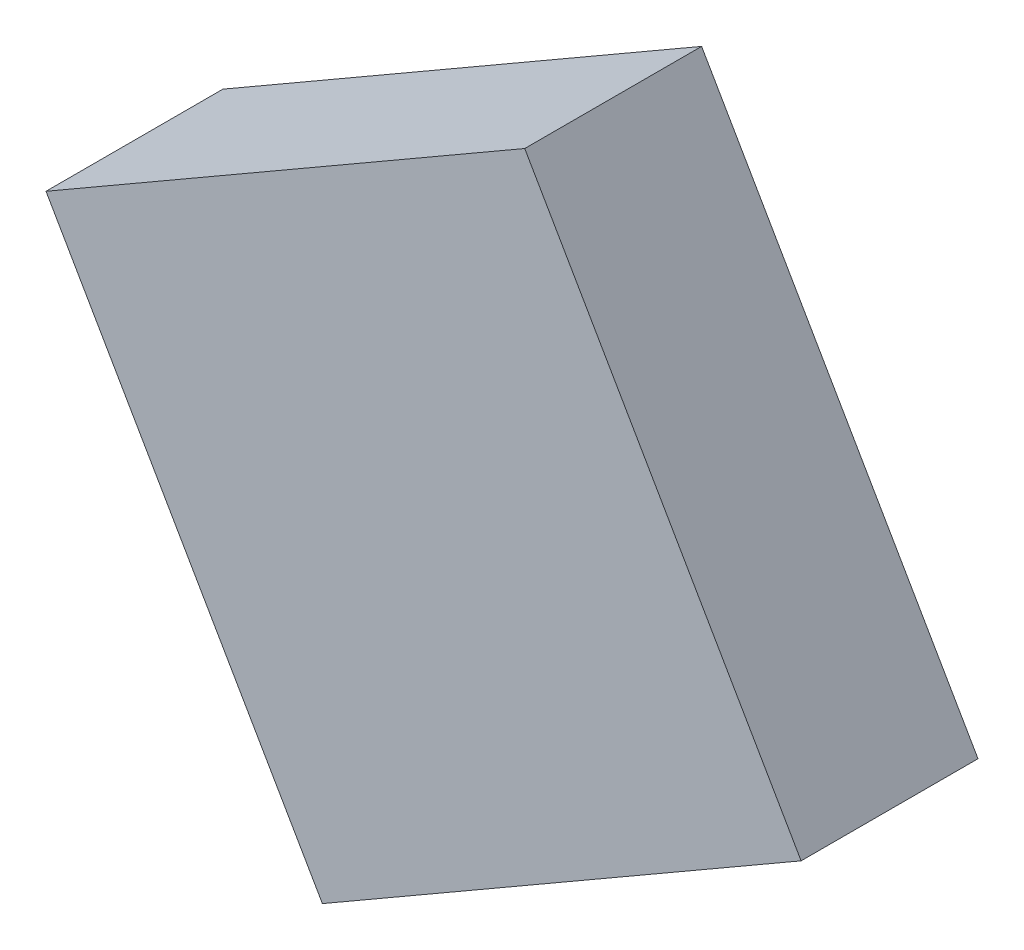
ISO-10303-21;
HEADER;
FILE_DESCRIPTION(('STEP AP214'),'2;1');
FILE_NAME('part.step','',(''),(''),'','','');
FILE_SCHEMA(('AUTOMOTIVE_DESIGN { 1 0 10303 214 1 1 1 1 }'));
ENDSEC;
DATA;
#1=APPLICATION_CONTEXT('core data for automotive mechanical design processes');
#2=APPLICATION_PROTOCOL_DEFINITION('international standard','automotive_design',2000,#1);
#3=PRODUCT_CONTEXT('',#1,'mechanical');
#4=PRODUCT('Part','Part','',(#3));
#5=PRODUCT_RELATED_PRODUCT_CATEGORY('part','',(#4));
#6=PRODUCT_DEFINITION_FORMATION('','',#4);
#7=PRODUCT_DEFINITION_CONTEXT('part definition',#1,'design');
#8=PRODUCT_DEFINITION('design','',#6,#7);
#9=PRODUCT_DEFINITION_SHAPE('','',#8);
#10=(LENGTH_UNIT() NAMED_UNIT(*) SI_UNIT(.MILLI.,.METRE.));
#11=(NAMED_UNIT(*) PLANE_ANGLE_UNIT() SI_UNIT($,.RADIAN.));
#12=(NAMED_UNIT(*) SI_UNIT($,.STERADIAN.) SOLID_ANGLE_UNIT());
#13=UNCERTAINTY_MEASURE_WITH_UNIT(LENGTH_MEASURE(1.E-05),#10,'distance_accuracy_value','');
#14=(GEOMETRIC_REPRESENTATION_CONTEXT(3) GLOBAL_UNCERTAINTY_ASSIGNED_CONTEXT((#13)) GLOBAL_UNIT_ASSIGNED_CONTEXT((#10,
#11,#12)) REPRESENTATION_CONTEXT('',''));
#15=CARTESIAN_POINT('',(0.,0.,0.));
#16=DIRECTION('',(0.,0.,1.));
#17=DIRECTION('',(1.,0.,0.));
#18=AXIS2_PLACEMENT_3D('',#15,#16,#17);
#19=CARTESIAN_POINT('',(-0.91507056,-3.41505286,1.59999934));
#20=DIRECTION('',(0.,0.,1.));
#21=DIRECTION('',(1.,0.,0.));
#22=AXIS2_PLACEMENT_3D('',#19,#20,#21);
#23=PLANE('',#22);
#24=DIRECTION('',(-0.866026756703429,-0.499997656668248,0.));
#25=VECTOR('',#24,1.);
#26=CARTESIAN_POINT('',(-3.41505286,0.91507056,1.59999934));
#27=LINE('',#26,#25);
#28=CARTESIAN_POINT('',(-3.41505285999986,0.915070560000085,1.59999934));
#29=VERTEX_POINT('',#28);
#30=CARTESIAN_POINT('',(0.915070560000085,3.41505285999986,1.59999934));
#31=VERTEX_POINT('',#30);
#32=EDGE_CURVE('E53',#29,#31,#27,.F.);
#33=ORIENTED_EDGE('',*,*,#32,.F.);
#34=DIRECTION('',(0.499997656668248,-0.866026756703429,0.));
#35=VECTOR('',#34,1.);
#36=CARTESIAN_POINT('',(-0.91507056,-3.41505286,1.59999934));
#37=LINE('',#36,#35);
#38=CARTESIAN_POINT('',(-0.915070560000171,-3.4150528599997,1.59999934));
#39=VERTEX_POINT('',#38);
#40=EDGE_CURVE('E68',#39,#29,#37,.F.);
#41=ORIENTED_EDGE('',*,*,#40,.F.);
#42=DIRECTION('',(0.866026756703429,0.499997656668248,0.));
#43=VECTOR('',#42,1.);
#44=CARTESIAN_POINT('',(3.41505286,-0.91507056,1.59999934));
#45=LINE('',#44,#43);
#46=CARTESIAN_POINT('',(3.41505285999986,-0.915070560000085,1.59999934));
#47=VERTEX_POINT('',#46);
#48=EDGE_CURVE('E20',#47,#39,#45,.F.);
#49=ORIENTED_EDGE('',*,*,#48,.F.);
#50=DIRECTION('',(-0.499997656668248,0.866026756703429,0.));
#51=VECTOR('',#50,1.);
#52=CARTESIAN_POINT('',(0.91507056,3.41505286,1.59999934));
#53=LINE('',#52,#51);
#54=EDGE_CURVE('E58',#31,#47,#53,.F.);
#55=ORIENTED_EDGE('',*,*,#54,.F.);
#56=EDGE_LOOP('',(#33,#41,#49,#55));
#57=FACE_BOUND('',#56,.T.);
#58=ADVANCED_FACE('F17',(#57),#23,.T.);
#59=CARTESIAN_POINT('',(3.41505286,-0.91507056,0.));
#60=DIRECTION('',(0.499997656668248,-0.866026756703429,0.));
#61=DIRECTION('',(0.866026756703429,0.499997656668248,0.));
#62=AXIS2_PLACEMENT_3D('',#59,#60,#61);
#63=PLANE('',#62);
#64=DIRECTION('',(0.,0.,1.));
#65=VECTOR('',#64,1.);
#66=CARTESIAN_POINT('',(-0.91507056,-3.41505286,0.));
#67=LINE('',#66,#65);
#68=CARTESIAN_POINT('',(-0.915070560000171,-3.4150528599997,0.));
#69=VERTEX_POINT('',#68);
#70=EDGE_CURVE('E79',#69,#39,#67,.T.);
#71=ORIENTED_EDGE('',*,*,#70,.F.);
#72=DIRECTION('',(0.866026756703361,0.499997656668366,0.));
#73=VECTOR('',#72,1.);
#74=CARTESIAN_POINT('',(-0.91507056,-3.41505286,0.));
#75=LINE('',#74,#73);
#76=CARTESIAN_POINT('',(3.41505285999986,-0.915070560000085,0.));
#77=VERTEX_POINT('',#76);
#78=EDGE_CURVE('E74',#69,#77,#75,.T.);
#79=ORIENTED_EDGE('',*,*,#78,.T.);
#80=DIRECTION('',(0.,0.,1.));
#81=VECTOR('',#80,1.);
#82=CARTESIAN_POINT('',(3.41505285999941,-0.915070560000341,0.));
#83=LINE('',#82,#81);
#84=EDGE_CURVE('E63',#47,#77,#83,.F.);
#85=ORIENTED_EDGE('',*,*,#84,.F.);
#86=ORIENTED_EDGE('',*,*,#48,.T.);
#87=EDGE_LOOP('',(#71,#79,#85,#86));
#88=FACE_BOUND('',#87,.T.);
#89=ADVANCED_FACE('F73',(#88),#63,.T.);
#90=CARTESIAN_POINT('',(0.91507056,3.41505286,0.));
#91=DIRECTION('',(0.866026756703429,0.499997656668248,0.));
#92=DIRECTION('',(-0.499997656668248,0.866026756703429,0.));
#93=AXIS2_PLACEMENT_3D('',#90,#91,#92);
#94=PLANE('',#93);
#95=ORIENTED_EDGE('',*,*,#84,.T.);
#96=DIRECTION('',(-0.499997656668366,0.866026756703361,0.));
#97=VECTOR('',#96,1.);
#98=CARTESIAN_POINT('',(3.41505286,-0.91507056,0.));
#99=LINE('',#98,#97);
#100=CARTESIAN_POINT('',(0.915070560000085,3.41505285999986,0.));
#101=VERTEX_POINT('',#100);
#102=EDGE_CURVE('E84',#77,#101,#99,.T.);
#103=ORIENTED_EDGE('',*,*,#102,.T.);
#104=DIRECTION('',(0.,0.,1.));
#105=VECTOR('',#104,1.);
#106=CARTESIAN_POINT('',(0.915070560000341,3.41505285999941,0.));
#107=LINE('',#106,#105);
#108=EDGE_CURVE('E65',#31,#101,#107,.F.);
#109=ORIENTED_EDGE('',*,*,#108,.F.);
#110=ORIENTED_EDGE('',*,*,#54,.T.);
#111=EDGE_LOOP('',(#95,#103,#109,#110));
#112=FACE_BOUND('',#111,.T.);
#113=ADVANCED_FACE('F60',(#112),#94,.T.);
#114=CARTESIAN_POINT('',(-3.41505286,0.91507056,0.));
#115=DIRECTION('',(-0.499997656668248,0.866026756703429,0.));
#116=DIRECTION('',(-0.866026756703429,-0.499997656668248,0.));
#117=AXIS2_PLACEMENT_3D('',#114,#115,#116);
#118=PLANE('',#117);
#119=ORIENTED_EDGE('',*,*,#108,.T.);
#120=DIRECTION('',(-0.866026756703361,-0.499997656668366,0.));
#121=VECTOR('',#120,1.);
#122=CARTESIAN_POINT('',(0.91507056,3.41505286,0.));
#123=LINE('',#122,#121);
#124=CARTESIAN_POINT('',(-3.41505285999986,0.915070560000085,0.));
#125=VERTEX_POINT('',#124);
#126=EDGE_CURVE('E26',#101,#125,#123,.T.);
#127=ORIENTED_EDGE('',*,*,#126,.T.);
#128=DIRECTION('',(0.,0.,1.));
#129=VECTOR('',#128,1.);
#130=CARTESIAN_POINT('',(-3.41505285999941,0.915070560000341,0.));
#131=LINE('',#130,#129);
#132=EDGE_CURVE('E34',#29,#125,#131,.F.);
#133=ORIENTED_EDGE('',*,*,#132,.F.);
#134=ORIENTED_EDGE('',*,*,#32,.T.);
#135=EDGE_LOOP('',(#119,#127,#133,#134));
#136=FACE_BOUND('',#135,.T.);
#137=ADVANCED_FACE('F88',(#136),#118,.T.);
#138=CARTESIAN_POINT('',(-0.91507056,-3.41505286,0.));
#139=DIRECTION('',(-0.866026756703429,-0.499997656668248,0.));
#140=DIRECTION('',(0.499997656668248,-0.866026756703429,0.));
#141=AXIS2_PLACEMENT_3D('',#138,#139,#140);
#142=PLANE('',#141);
#143=ORIENTED_EDGE('',*,*,#132,.T.);
#144=DIRECTION('',(0.499997656668366,-0.866026756703361,0.));
#145=VECTOR('',#144,1.);
#146=CARTESIAN_POINT('',(-3.41505286,0.91507056,0.));
#147=LINE('',#146,#145);
#148=EDGE_CURVE('E11',#125,#69,#147,.T.);
#149=ORIENTED_EDGE('',*,*,#148,.T.);
#150=ORIENTED_EDGE('',*,*,#70,.T.);
#151=ORIENTED_EDGE('',*,*,#40,.T.);
#152=EDGE_LOOP('',(#143,#149,#150,#151));
#153=FACE_BOUND('',#152,.T.);
#154=ADVANCED_FACE('F91',(#153),#142,.T.);
#155=CARTESIAN_POINT('',(-0.91507056,-3.41505286,0.));
#156=DIRECTION('',(0.,0.,1.));
#157=DIRECTION('',(1.,0.,0.));
#158=AXIS2_PLACEMENT_3D('',#155,#156,#157);
#159=PLANE('',#158);
#160=ORIENTED_EDGE('',*,*,#126,.F.);
#161=ORIENTED_EDGE('',*,*,#102,.F.);
#162=ORIENTED_EDGE('',*,*,#78,.F.);
#163=ORIENTED_EDGE('',*,*,#148,.F.);
#164=EDGE_LOOP('',(#160,#161,#162,#163));
#165=FACE_BOUND('',#164,.T.);
#166=ADVANCED_FACE('F90',(#165),#159,.F.);
#167=CLOSED_SHELL('',(#58,#89,#113,#137,#154,#166));
#168=MANIFOLD_SOLID_BREP('B1',#167);
#169=ADVANCED_BREP_SHAPE_REPRESENTATION('',(#18,#168),#14);
#170=SHAPE_DEFINITION_REPRESENTATION(#9,#169);
ENDSEC;
END-ISO-10303-21;
